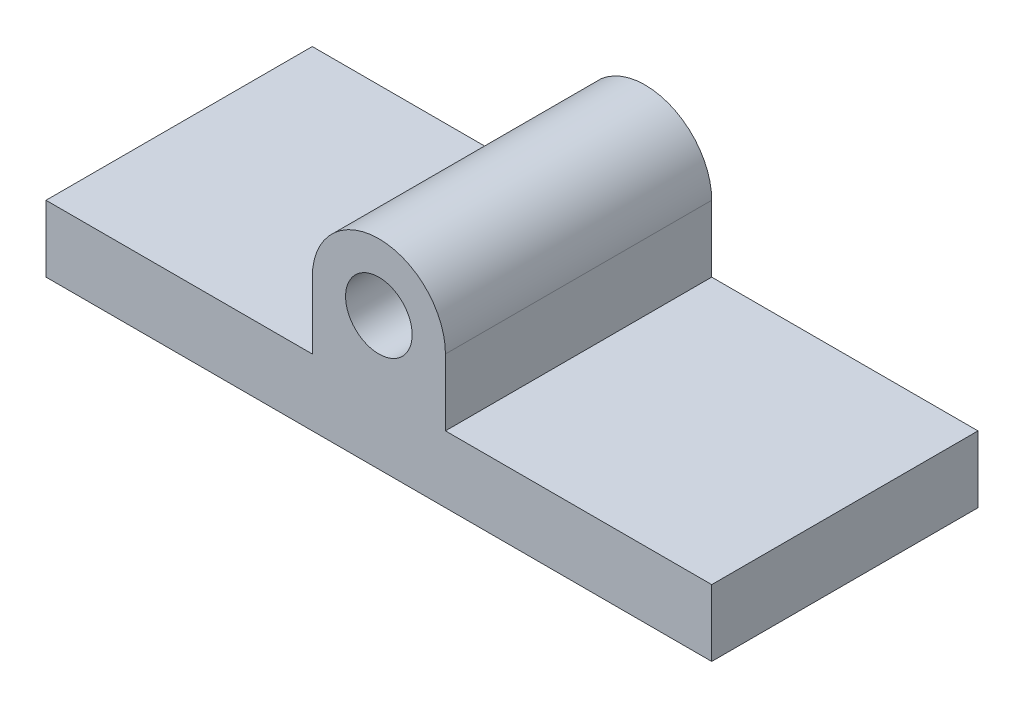
ISO-10303-21;
HEADER;
FILE_DESCRIPTION(('STEP AP214'),'2;1');
FILE_NAME('part.step','',(''),(''),'','','');
FILE_SCHEMA(('AUTOMOTIVE_DESIGN { 1 0 10303 214 1 1 1 1 }'));
ENDSEC;
DATA;
#1=APPLICATION_CONTEXT('core data for automotive mechanical design processes');
#2=APPLICATION_PROTOCOL_DEFINITION('international standard','automotive_design',2000,#1);
#3=PRODUCT_CONTEXT('',#1,'mechanical');
#4=PRODUCT('Part','Part','',(#3));
#5=PRODUCT_RELATED_PRODUCT_CATEGORY('part','',(#4));
#6=PRODUCT_DEFINITION_FORMATION('','',#4);
#7=PRODUCT_DEFINITION_CONTEXT('part definition',#1,'design');
#8=PRODUCT_DEFINITION('design','',#6,#7);
#9=PRODUCT_DEFINITION_SHAPE('','',#8);
#10=(LENGTH_UNIT() NAMED_UNIT(*) SI_UNIT(.MILLI.,.METRE.));
#11=(NAMED_UNIT(*) PLANE_ANGLE_UNIT() SI_UNIT($,.RADIAN.));
#12=(NAMED_UNIT(*) SI_UNIT($,.STERADIAN.) SOLID_ANGLE_UNIT());
#13=UNCERTAINTY_MEASURE_WITH_UNIT(LENGTH_MEASURE(1.E-05),#10,'distance_accuracy_value','');
#14=(GEOMETRIC_REPRESENTATION_CONTEXT(3) GLOBAL_UNCERTAINTY_ASSIGNED_CONTEXT((#13)) GLOBAL_UNIT_ASSIGNED_CONTEXT((#10,
#11,#12)) REPRESENTATION_CONTEXT('',''));
#15=CARTESIAN_POINT('',(0.,0.,0.));
#16=DIRECTION('',(0.,0.,1.));
#17=DIRECTION('',(1.,0.,0.));
#18=AXIS2_PLACEMENT_3D('',#15,#16,#17);
#19=CARTESIAN_POINT('',(25.,5.,20.));
#20=DIRECTION('',(0.,-1.,0.));
#21=DIRECTION('',(0.,0.,-1.));
#22=AXIS2_PLACEMENT_3D('',#19,#20,#21);
#23=PLANE('',#22);
#24=DIRECTION('',(0.,0.,1.));
#25=VECTOR('',#24,1.);
#26=CARTESIAN_POINT('',(-5.,5.,0.));
#27=LINE('',#26,#25);
#28=CARTESIAN_POINT('',(-5.,5.,0.));
#29=VERTEX_POINT('',#28);
#30=CARTESIAN_POINT('',(-5.,5.,20.));
#31=VERTEX_POINT('',#30);
#32=EDGE_CURVE('E118',#29,#31,#27,.T.);
#33=ORIENTED_EDGE('',*,*,#32,.F.);
#34=DIRECTION('',(-1.,0.,0.));
#35=VECTOR('',#34,1.);
#36=CARTESIAN_POINT('',(25.,5.,0.));
#37=LINE('',#36,#35);
#38=CARTESIAN_POINT('',(-25.,5.,0.));
#39=VERTEX_POINT('',#38);
#40=EDGE_CURVE('E81',#29,#39,#37,.T.);
#41=ORIENTED_EDGE('',*,*,#40,.T.);
#42=DIRECTION('',(0.,0.,-1.));
#43=VECTOR('',#42,1.);
#44=CARTESIAN_POINT('',(-25.,5.,20.));
#45=LINE('',#44,#43);
#46=CARTESIAN_POINT('',(-25.,5.,20.));
#47=VERTEX_POINT('',#46);
#48=EDGE_CURVE('E156',#47,#39,#45,.T.);
#49=ORIENTED_EDGE('',*,*,#48,.F.);
#50=DIRECTION('',(-1.,0.,0.));
#51=VECTOR('',#50,1.);
#52=CARTESIAN_POINT('',(25.,5.,20.));
#53=LINE('',#52,#51);
#54=EDGE_CURVE('E59',#31,#47,#53,.T.);
#55=ORIENTED_EDGE('',*,*,#54,.F.);
#56=EDGE_LOOP('',(#33,#41,#49,#55));
#57=FACE_BOUND('',#56,.T.);
#58=ADVANCED_FACE('F35',(#57),#23,.F.);
#59=CARTESIAN_POINT('',(-25.,0.,20.));
#60=DIRECTION('',(1.,0.,0.));
#61=DIRECTION('',(0.,0.,-1.));
#62=AXIS2_PLACEMENT_3D('',#59,#60,#61);
#63=PLANE('',#62);
#64=DIRECTION('',(0.,-1.,0.));
#65=VECTOR('',#64,1.);
#66=CARTESIAN_POINT('',(-25.,0.,0.));
#67=LINE('',#66,#65);
#68=CARTESIAN_POINT('',(-25.,0.,0.));
#69=VERTEX_POINT('',#68);
#70=EDGE_CURVE('E143',#39,#69,#67,.T.);
#71=ORIENTED_EDGE('',*,*,#70,.T.);
#72=DIRECTION('',(0.,0.,-1.));
#73=VECTOR('',#72,1.);
#74=CARTESIAN_POINT('',(-25.,0.,20.));
#75=LINE('',#74,#73);
#76=CARTESIAN_POINT('',(-25.,0.,20.));
#77=VERTEX_POINT('',#76);
#78=EDGE_CURVE('E11',#77,#69,#75,.T.);
#79=ORIENTED_EDGE('',*,*,#78,.F.);
#80=DIRECTION('',(0.,-1.,0.));
#81=VECTOR('',#80,1.);
#82=CARTESIAN_POINT('',(-25.,0.,20.));
#83=LINE('',#82,#81);
#84=EDGE_CURVE('E147',#47,#77,#83,.T.);
#85=ORIENTED_EDGE('',*,*,#84,.F.);
#86=ORIENTED_EDGE('',*,*,#48,.T.);
#87=EDGE_LOOP('',(#71,#79,#85,#86));
#88=FACE_BOUND('',#87,.T.);
#89=ADVANCED_FACE('F37',(#88),#63,.F.);
#90=CARTESIAN_POINT('',(-25.,0.,20.));
#91=DIRECTION('',(0.,1.,0.));
#92=DIRECTION('',(0.,0.,1.));
#93=AXIS2_PLACEMENT_3D('',#90,#91,#92);
#94=PLANE('',#93);
#95=DIRECTION('',(1.,0.,0.));
#96=VECTOR('',#95,1.);
#97=CARTESIAN_POINT('',(-25.,0.,0.));
#98=LINE('',#97,#96);
#99=CARTESIAN_POINT('',(25.,0.,0.));
#100=VERTEX_POINT('',#99);
#101=EDGE_CURVE('E159',#69,#100,#98,.T.);
#102=ORIENTED_EDGE('',*,*,#101,.T.);
#103=DIRECTION('',(0.,0.,-1.));
#104=VECTOR('',#103,1.);
#105=CARTESIAN_POINT('',(25.,0.,20.));
#106=LINE('',#105,#104);
#107=CARTESIAN_POINT('',(25.,0.,20.));
#108=VERTEX_POINT('',#107);
#109=EDGE_CURVE('E43',#108,#100,#106,.T.);
#110=ORIENTED_EDGE('',*,*,#109,.F.);
#111=DIRECTION('',(1.,0.,0.));
#112=VECTOR('',#111,1.);
#113=CARTESIAN_POINT('',(-25.,0.,20.));
#114=LINE('',#113,#112);
#115=EDGE_CURVE('E88',#77,#108,#114,.T.);
#116=ORIENTED_EDGE('',*,*,#115,.F.);
#117=ORIENTED_EDGE('',*,*,#78,.T.);
#118=EDGE_LOOP('',(#102,#110,#116,#117));
#119=FACE_BOUND('',#118,.T.);
#120=ADVANCED_FACE('F182',(#119),#94,.F.);
#121=CARTESIAN_POINT('',(25.,0.,20.));
#122=DIRECTION('',(-1.,0.,0.));
#123=DIRECTION('',(0.,0.,1.));
#124=AXIS2_PLACEMENT_3D('',#121,#122,#123);
#125=PLANE('',#124);
#126=DIRECTION('',(0.,1.,0.));
#127=VECTOR('',#126,1.);
#128=CARTESIAN_POINT('',(25.,0.,0.));
#129=LINE('',#128,#127);
#130=CARTESIAN_POINT('',(25.,5.,0.));
#131=VERTEX_POINT('',#130);
#132=EDGE_CURVE('E161',#100,#131,#129,.T.);
#133=ORIENTED_EDGE('',*,*,#132,.T.);
#134=DIRECTION('',(0.,0.,-1.));
#135=VECTOR('',#134,1.);
#136=CARTESIAN_POINT('',(25.,5.,20.));
#137=LINE('',#136,#135);
#138=CARTESIAN_POINT('',(25.,5.,20.));
#139=VERTEX_POINT('',#138);
#140=EDGE_CURVE('E166',#139,#131,#137,.T.);
#141=ORIENTED_EDGE('',*,*,#140,.F.);
#142=DIRECTION('',(0.,1.,0.));
#143=VECTOR('',#142,1.);
#144=CARTESIAN_POINT('',(25.,0.,20.));
#145=LINE('',#144,#143);
#146=EDGE_CURVE('E151',#108,#139,#145,.T.);
#147=ORIENTED_EDGE('',*,*,#146,.F.);
#148=ORIENTED_EDGE('',*,*,#109,.T.);
#149=EDGE_LOOP('',(#133,#141,#147,#148));
#150=FACE_BOUND('',#149,.T.);
#151=ADVANCED_FACE('F172',(#150),#125,.F.);
#152=CARTESIAN_POINT('',(5.,5.,0.));
#153=VERTEX_POINT('',#152);
#154=EDGE_CURVE('E149',#131,#153,#37,.T.);
#155=ORIENTED_EDGE('',*,*,#154,.T.);
#156=DIRECTION('',(0.,0.,1.));
#157=VECTOR('',#156,1.);
#158=CARTESIAN_POINT('',(5.,5.,0.));
#159=LINE('',#158,#157);
#160=CARTESIAN_POINT('',(5.,5.,20.));
#161=VERTEX_POINT('',#160);
#162=EDGE_CURVE('E144',#153,#161,#159,.T.);
#163=ORIENTED_EDGE('',*,*,#162,.T.);
#164=EDGE_CURVE('E153',#139,#161,#53,.T.);
#165=ORIENTED_EDGE('',*,*,#164,.F.);
#166=ORIENTED_EDGE('',*,*,#140,.T.);
#167=EDGE_LOOP('',(#155,#163,#165,#166));
#168=FACE_BOUND('',#167,.T.);
#169=ADVANCED_FACE('F176',(#168),#23,.F.);
#170=CARTESIAN_POINT('',(0.,0.,20.));
#171=DIRECTION('',(0.,0.,1.));
#172=DIRECTION('',(1.,0.,0.));
#173=AXIS2_PLACEMENT_3D('',#170,#171,#172);
#174=PLANE('',#173);
#175=CARTESIAN_POINT('',(0.,10.,20.));
#176=DIRECTION('',(0.,0.,1.));
#177=DIRECTION('',(1.,0.,0.));
#178=AXIS2_PLACEMENT_3D('',#175,#176,#177);
#179=CIRCLE('',#178,2.5);
#180=CARTESIAN_POINT('',(2.5,10.,20.));
#181=VERTEX_POINT('',#180);
#182=EDGE_CURVE('E134',#181,#181,#179,.T.);
#183=ORIENTED_EDGE('',*,*,#182,.F.);
#184=EDGE_LOOP('',(#183));
#185=FACE_BOUND('',#184,.T.);
#186=ORIENTED_EDGE('',*,*,#84,.T.);
#187=ORIENTED_EDGE('',*,*,#115,.T.);
#188=ORIENTED_EDGE('',*,*,#146,.T.);
#189=ORIENTED_EDGE('',*,*,#164,.T.);
#190=DIRECTION('',(0.,1.,0.));
#191=VECTOR('',#190,1.);
#192=CARTESIAN_POINT('',(5.,5.,20.));
#193=LINE('',#192,#191);
#194=CARTESIAN_POINT('',(5.,10.,20.));
#195=VERTEX_POINT('',#194);
#196=EDGE_CURVE('E50',#161,#195,#193,.T.);
#197=ORIENTED_EDGE('',*,*,#196,.T.);
#198=CARTESIAN_POINT('',(0.,10.,20.));
#199=DIRECTION('',(0.,0.,1.));
#200=DIRECTION('',(1.,0.,0.));
#201=AXIS2_PLACEMENT_3D('',#198,#199,#200);
#202=CIRCLE('',#201,5.);
#203=CARTESIAN_POINT('',(-5.,10.,20.));
#204=VERTEX_POINT('',#203);
#205=EDGE_CURVE('E138',#195,#204,#202,.T.);
#206=ORIENTED_EDGE('',*,*,#205,.T.);
#207=DIRECTION('',(0.,-1.,0.));
#208=VECTOR('',#207,1.);
#209=CARTESIAN_POINT('',(-5.,10.,20.));
#210=LINE('',#209,#208);
#211=EDGE_CURVE('E113',#204,#31,#210,.T.);
#212=ORIENTED_EDGE('',*,*,#211,.T.);
#213=ORIENTED_EDGE('',*,*,#54,.T.);
#214=EDGE_LOOP('',(#186,#187,#188,#189,#197,#206,#212,#213));
#215=FACE_BOUND('',#214,.T.);
#216=ADVANCED_FACE('F178',(#185,#215),#174,.T.);
#217=CARTESIAN_POINT('',(0.,0.,0.));
#218=DIRECTION('',(0.,0.,1.));
#219=DIRECTION('',(1.,0.,0.));
#220=AXIS2_PLACEMENT_3D('',#217,#218,#219);
#221=PLANE('',#220);
#222=CARTESIAN_POINT('',(0.,10.,0.));
#223=DIRECTION('',(0.,0.,1.));
#224=DIRECTION('',(1.,0.,0.));
#225=AXIS2_PLACEMENT_3D('',#222,#223,#224);
#226=CIRCLE('',#225,2.5);
#227=CARTESIAN_POINT('',(2.5,10.,0.));
#228=VERTEX_POINT('',#227);
#229=EDGE_CURVE('E140',#228,#228,#226,.T.);
#230=ORIENTED_EDGE('',*,*,#229,.T.);
#231=EDGE_LOOP('',(#230));
#232=FACE_BOUND('',#231,.T.);
#233=ORIENTED_EDGE('',*,*,#70,.F.);
#234=ORIENTED_EDGE('',*,*,#40,.F.);
#235=DIRECTION('',(0.,-1.,0.));
#236=VECTOR('',#235,1.);
#237=CARTESIAN_POINT('',(-5.,10.,0.));
#238=LINE('',#237,#236);
#239=CARTESIAN_POINT('',(-5.,10.,0.));
#240=VERTEX_POINT('',#239);
#241=EDGE_CURVE('E112',#240,#29,#238,.T.);
#242=ORIENTED_EDGE('',*,*,#241,.F.);
#243=CARTESIAN_POINT('',(0.,10.,0.));
#244=DIRECTION('',(0.,0.,1.));
#245=DIRECTION('',(1.,0.,0.));
#246=AXIS2_PLACEMENT_3D('',#243,#244,#245);
#247=CIRCLE('',#246,5.);
#248=CARTESIAN_POINT('',(5.,10.,0.));
#249=VERTEX_POINT('',#248);
#250=EDGE_CURVE('E126',#249,#240,#247,.T.);
#251=ORIENTED_EDGE('',*,*,#250,.F.);
#252=DIRECTION('',(0.,1.,0.));
#253=VECTOR('',#252,1.);
#254=CARTESIAN_POINT('',(5.,5.,0.));
#255=LINE('',#254,#253);
#256=EDGE_CURVE('E119',#153,#249,#255,.T.);
#257=ORIENTED_EDGE('',*,*,#256,.F.);
#258=ORIENTED_EDGE('',*,*,#154,.F.);
#259=ORIENTED_EDGE('',*,*,#132,.F.);
#260=ORIENTED_EDGE('',*,*,#101,.F.);
#261=EDGE_LOOP('',(#233,#234,#242,#251,#257,#258,#259,#260));
#262=FACE_BOUND('',#261,.T.);
#263=ADVANCED_FACE('F124',(#232,#262),#221,.F.);
#264=CARTESIAN_POINT('',(0.,10.,0.));
#265=DIRECTION('',(0.,0.,1.));
#266=DIRECTION('',(1.,0.,0.));
#267=AXIS2_PLACEMENT_3D('',#264,#265,#266);
#268=CYLINDRICAL_SURFACE('',#267,5.);
#269=ORIENTED_EDGE('',*,*,#205,.F.);
#270=DIRECTION('',(0.,0.,1.));
#271=VECTOR('',#270,1.);
#272=CARTESIAN_POINT('',(5.,10.,0.));
#273=LINE('',#272,#271);
#274=EDGE_CURVE('E130',#249,#195,#273,.T.);
#275=ORIENTED_EDGE('',*,*,#274,.F.);
#276=ORIENTED_EDGE('',*,*,#250,.T.);
#277=DIRECTION('',(0.,0.,1.));
#278=VECTOR('',#277,1.);
#279=CARTESIAN_POINT('',(-5.,10.,0.));
#280=LINE('',#279,#278);
#281=EDGE_CURVE('E109',#240,#204,#280,.T.);
#282=ORIENTED_EDGE('',*,*,#281,.T.);
#283=EDGE_LOOP('',(#269,#275,#276,#282));
#284=FACE_BOUND('',#283,.T.);
#285=ADVANCED_FACE('F129',(#284),#268,.T.);
#286=CARTESIAN_POINT('',(5.,5.,0.));
#287=DIRECTION('',(1.,0.,0.));
#288=DIRECTION('',(0.,0.,-1.));
#289=AXIS2_PLACEMENT_3D('',#286,#287,#288);
#290=PLANE('',#289);
#291=ORIENTED_EDGE('',*,*,#196,.F.);
#292=ORIENTED_EDGE('',*,*,#162,.F.);
#293=ORIENTED_EDGE('',*,*,#256,.T.);
#294=ORIENTED_EDGE('',*,*,#274,.T.);
#295=EDGE_LOOP('',(#291,#292,#293,#294));
#296=FACE_BOUND('',#295,.T.);
#297=ADVANCED_FACE('F208',(#296),#290,.T.);
#298=CARTESIAN_POINT('',(-5.,10.,0.));
#299=DIRECTION('',(-1.,0.,0.));
#300=DIRECTION('',(0.,-1.,0.));
#301=AXIS2_PLACEMENT_3D('',#298,#299,#300);
#302=PLANE('',#301);
#303=ORIENTED_EDGE('',*,*,#211,.F.);
#304=ORIENTED_EDGE('',*,*,#281,.F.);
#305=ORIENTED_EDGE('',*,*,#241,.T.);
#306=ORIENTED_EDGE('',*,*,#32,.T.);
#307=EDGE_LOOP('',(#303,#304,#305,#306));
#308=FACE_BOUND('',#307,.T.);
#309=ADVANCED_FACE('F111',(#308),#302,.T.);
#310=CARTESIAN_POINT('',(0.,10.,0.));
#311=DIRECTION('',(0.,0.,1.));
#312=DIRECTION('',(1.,0.,0.));
#313=AXIS2_PLACEMENT_3D('',#310,#311,#312);
#314=CYLINDRICAL_SURFACE('',#313,2.5);
#315=ORIENTED_EDGE('',*,*,#229,.F.);
#316=EDGE_LOOP('',(#315));
#317=FACE_BOUND('',#316,.T.);
#318=ORIENTED_EDGE('',*,*,#182,.T.);
#319=EDGE_LOOP('',(#318));
#320=FACE_BOUND('',#319,.T.);
#321=ADVANCED_FACE('F211',(#317,#320),#314,.F.);
#322=CLOSED_SHELL('',(#58,#89,#120,#151,#169,#216,#263,#285,#297,#309,#321));
#323=MANIFOLD_SOLID_BREP('B2',#322);
#324=ADVANCED_BREP_SHAPE_REPRESENTATION('',(#18,#323),#14);
#325=SHAPE_DEFINITION_REPRESENTATION(#9,#324);
ENDSEC;
END-ISO-10303-21;
